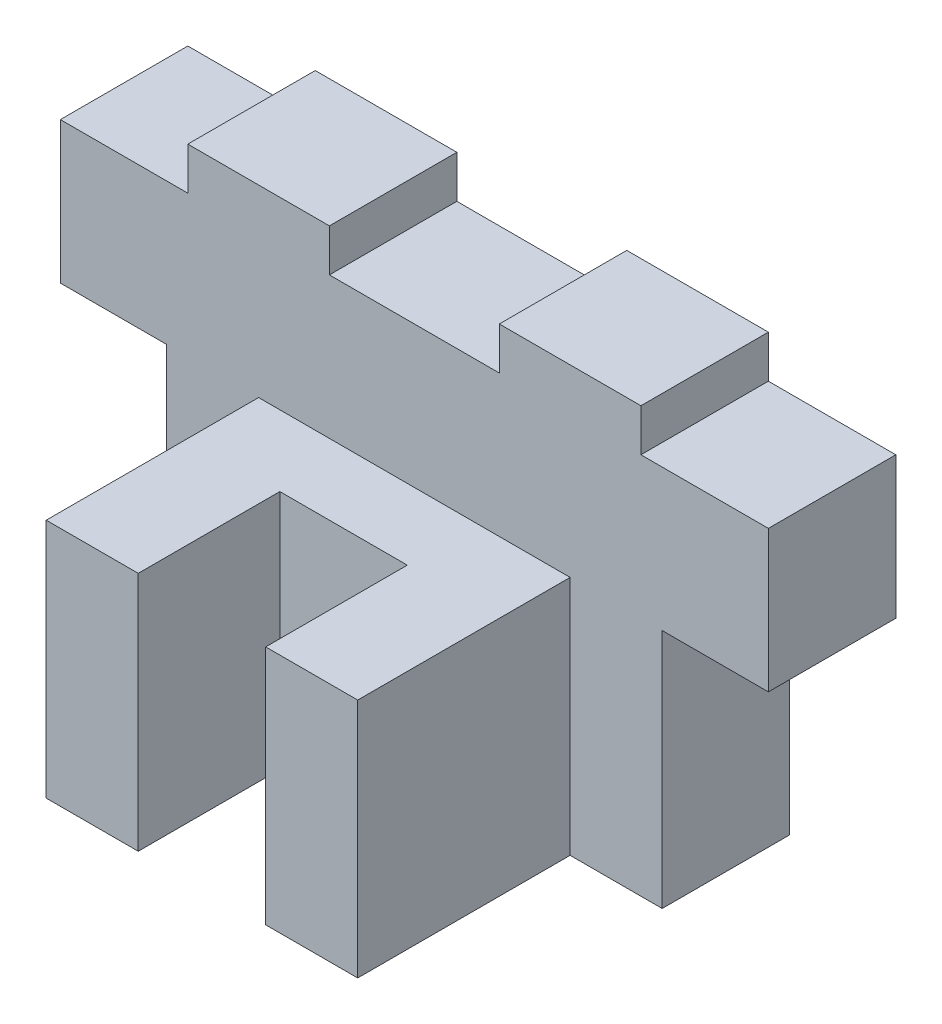
ISO-10303-21;
HEADER;
FILE_DESCRIPTION(('STEP AP214'),'2;1');
FILE_NAME('part.step','',(''),(''),'','','');
FILE_SCHEMA(('AUTOMOTIVE_DESIGN { 1 0 10303 214 1 1 1 1 }'));
ENDSEC;
DATA;
#1=APPLICATION_CONTEXT('core data for automotive mechanical design processes');
#2=APPLICATION_PROTOCOL_DEFINITION('international standard','automotive_design',2000,#1);
#3=PRODUCT_CONTEXT('',#1,'mechanical');
#4=PRODUCT('Part','Part','',(#3));
#5=PRODUCT_RELATED_PRODUCT_CATEGORY('part','',(#4));
#6=PRODUCT_DEFINITION_FORMATION('','',#4);
#7=PRODUCT_DEFINITION_CONTEXT('part definition',#1,'design');
#8=PRODUCT_DEFINITION('design','',#6,#7);
#9=PRODUCT_DEFINITION_SHAPE('','',#8);
#10=(LENGTH_UNIT() NAMED_UNIT(*) SI_UNIT(.MILLI.,.METRE.));
#11=(NAMED_UNIT(*) PLANE_ANGLE_UNIT() SI_UNIT($,.RADIAN.));
#12=(NAMED_UNIT(*) SI_UNIT($,.STERADIAN.) SOLID_ANGLE_UNIT());
#13=UNCERTAINTY_MEASURE_WITH_UNIT(LENGTH_MEASURE(1.E-05),#10,'distance_accuracy_value','');
#14=(GEOMETRIC_REPRESENTATION_CONTEXT(3) GLOBAL_UNCERTAINTY_ASSIGNED_CONTEXT((#13)) GLOBAL_UNIT_ASSIGNED_CONTEXT((#10,
#11,#12)) REPRESENTATION_CONTEXT('',''));
#15=CARTESIAN_POINT('',(0.,0.,0.));
#16=DIRECTION('',(0.,0.,1.));
#17=DIRECTION('',(1.,0.,0.));
#18=AXIS2_PLACEMENT_3D('',#15,#16,#17);
#19=CARTESIAN_POINT('',(0.,0.,9.));
#20=DIRECTION('',(0.,0.,1.));
#21=DIRECTION('',(1.,0.,0.));
#22=AXIS2_PLACEMENT_3D('',#19,#20,#21);
#23=PLANE('',#22);
#24=DIRECTION('',(-1.,0.,0.));
#25=VECTOR('',#24,1.);
#26=CARTESIAN_POINT('',(-25.,-15.,9.));
#27=LINE('',#26,#25);
#28=CARTESIAN_POINT('',(-23.5,-15.,9.));
#29=VERTEX_POINT('',#28);
#30=CARTESIAN_POINT('',(-30.,-15.,9.));
#31=VERTEX_POINT('',#30);
#32=EDGE_CURVE('E38',#29,#31,#27,.T.);
#33=ORIENTED_EDGE('',*,*,#32,.F.);
#34=DIRECTION('',(0.,-1.,0.));
#35=VECTOR('',#34,1.);
#36=CARTESIAN_POINT('',(-23.5,20.6010752377383,9.));
#37=LINE('',#36,#35);
#38=CARTESIAN_POINT('',(-23.5,2.,9.));
#39=VERTEX_POINT('',#38);
#40=EDGE_CURVE('E227',#39,#29,#37,.T.);
#41=ORIENTED_EDGE('',*,*,#40,.F.);
#42=DIRECTION('',(1.,0.,0.));
#43=VECTOR('',#42,1.);
#44=CARTESIAN_POINT('',(0.,2.,9.));
#45=LINE('',#44,#43);
#46=CARTESIAN_POINT('',(-1.5,2.,9.));
#47=VERTEX_POINT('',#46);
#48=EDGE_CURVE('E51',#39,#47,#45,.T.);
#49=ORIENTED_EDGE('',*,*,#48,.T.);
#50=DIRECTION('',(0.,-1.,0.));
#51=VECTOR('',#50,1.);
#52=CARTESIAN_POINT('',(-1.5,20.6010752377383,9.));
#53=LINE('',#52,#51);
#54=CARTESIAN_POINT('',(-1.5,-15.,9.));
#55=VERTEX_POINT('',#54);
#56=EDGE_CURVE('E309',#47,#55,#53,.T.);
#57=ORIENTED_EDGE('',*,*,#56,.T.);
#58=DIRECTION('',(1.,0.,0.));
#59=VECTOR('',#58,1.);
#60=CARTESIAN_POINT('',(0.,-15.,9.));
#61=LINE('',#60,#59);
#62=CARTESIAN_POINT('',(5.,-15.,9.));
#63=VERTEX_POINT('',#62);
#64=EDGE_CURVE('E360',#55,#63,#61,.T.);
#65=ORIENTED_EDGE('',*,*,#64,.T.);
#66=DIRECTION('',(0.,1.,0.));
#67=VECTOR('',#66,1.);
#68=CARTESIAN_POINT('',(5.,0.,9.));
#69=LINE('',#68,#67);
#70=CARTESIAN_POINT('',(5.,2.,9.));
#71=VERTEX_POINT('',#70);
#72=EDGE_CURVE('E375',#63,#71,#69,.T.);
#73=ORIENTED_EDGE('',*,*,#72,.T.);
#74=DIRECTION('',(-1.,0.,0.));
#75=VECTOR('',#74,1.);
#76=CARTESIAN_POINT('',(0.,2.,9.));
#77=LINE('',#76,#75);
#78=CARTESIAN_POINT('',(12.5,2.,9.));
#79=VERTEX_POINT('',#78);
#80=EDGE_CURVE('E379',#79,#71,#77,.T.);
#81=ORIENTED_EDGE('',*,*,#80,.F.);
#82=DIRECTION('',(0.,1.,0.));
#83=VECTOR('',#82,1.);
#84=CARTESIAN_POINT('',(12.5,0.,9.));
#85=LINE('',#84,#83);
#86=CARTESIAN_POINT('',(12.5,12.,9.));
#87=VERTEX_POINT('',#86);
#88=EDGE_CURVE('E382',#79,#87,#85,.T.);
#89=ORIENTED_EDGE('',*,*,#88,.T.);
#90=DIRECTION('',(-1.,0.,0.));
#91=VECTOR('',#90,1.);
#92=CARTESIAN_POINT('',(0.,12.,9.));
#93=LINE('',#92,#91);
#94=CARTESIAN_POINT('',(3.5,12.,9.));
#95=VERTEX_POINT('',#94);
#96=EDGE_CURVE('E384',#87,#95,#93,.T.);
#97=ORIENTED_EDGE('',*,*,#96,.T.);
#98=DIRECTION('',(0.,-1.,0.));
#99=VECTOR('',#98,1.);
#100=CARTESIAN_POINT('',(3.5,0.,9.));
#101=LINE('',#100,#99);
#102=CARTESIAN_POINT('',(3.5,15.,9.));
#103=VERTEX_POINT('',#102);
#104=EDGE_CURVE('E386',#103,#95,#101,.T.);
#105=ORIENTED_EDGE('',*,*,#104,.F.);
#106=DIRECTION('',(1.,0.,0.));
#107=VECTOR('',#106,1.);
#108=CARTESIAN_POINT('',(0.,15.,9.));
#109=LINE('',#108,#107);
#110=CARTESIAN_POINT('',(-6.5,15.,9.));
#111=VERTEX_POINT('',#110);
#112=EDGE_CURVE('E389',#111,#103,#109,.T.);
#113=ORIENTED_EDGE('',*,*,#112,.F.);
#114=DIRECTION('',(0.,-1.,0.));
#115=VECTOR('',#114,1.);
#116=CARTESIAN_POINT('',(-6.5,0.,9.));
#117=LINE('',#116,#115);
#118=CARTESIAN_POINT('',(-6.5,12.,9.));
#119=VERTEX_POINT('',#118);
#120=EDGE_CURVE('E391',#111,#119,#117,.T.);
#121=ORIENTED_EDGE('',*,*,#120,.T.);
#122=DIRECTION('',(1.,0.,0.));
#123=VECTOR('',#122,1.);
#124=CARTESIAN_POINT('',(0.,12.,9.));
#125=LINE('',#124,#123);
#126=CARTESIAN_POINT('',(-18.5,12.,9.));
#127=VERTEX_POINT('',#126);
#128=EDGE_CURVE('E338',#127,#119,#125,.T.);
#129=ORIENTED_EDGE('',*,*,#128,.F.);
#130=DIRECTION('',(0.,-1.,0.));
#131=VECTOR('',#130,1.);
#132=CARTESIAN_POINT('',(-18.5,0.,9.));
#133=LINE('',#132,#131);
#134=CARTESIAN_POINT('',(-18.5,15.,9.));
#135=VERTEX_POINT('',#134);
#136=EDGE_CURVE('E246',#135,#127,#133,.T.);
#137=ORIENTED_EDGE('',*,*,#136,.F.);
#138=DIRECTION('',(-1.,0.,0.));
#139=VECTOR('',#138,1.);
#140=CARTESIAN_POINT('',(-25.,15.,9.));
#141=LINE('',#140,#139);
#142=CARTESIAN_POINT('',(-28.5,15.,9.));
#143=VERTEX_POINT('',#142);
#144=EDGE_CURVE('E249',#135,#143,#141,.T.);
#145=ORIENTED_EDGE('',*,*,#144,.T.);
#146=DIRECTION('',(0.,-1.,0.));
#147=VECTOR('',#146,1.);
#148=CARTESIAN_POINT('',(-28.5,0.,9.));
#149=LINE('',#148,#147);
#150=CARTESIAN_POINT('',(-28.5,12.,9.));
#151=VERTEX_POINT('',#150);
#152=EDGE_CURVE('E251',#143,#151,#149,.T.);
#153=ORIENTED_EDGE('',*,*,#152,.T.);
#154=DIRECTION('',(1.,0.,0.));
#155=VECTOR('',#154,1.);
#156=CARTESIAN_POINT('',(-25.,12.,9.));
#157=LINE('',#156,#155);
#158=CARTESIAN_POINT('',(-37.5,12.,9.));
#159=VERTEX_POINT('',#158);
#160=EDGE_CURVE('E253',#159,#151,#157,.T.);
#161=ORIENTED_EDGE('',*,*,#160,.F.);
#162=DIRECTION('',(0.,1.,0.));
#163=VECTOR('',#162,1.);
#164=CARTESIAN_POINT('',(-37.5,0.,9.));
#165=LINE('',#164,#163);
#166=CARTESIAN_POINT('',(-37.5,1.99999999999999,9.));
#167=VERTEX_POINT('',#166);
#168=EDGE_CURVE('E256',#167,#159,#165,.T.);
#169=ORIENTED_EDGE('',*,*,#168,.F.);
#170=DIRECTION('',(1.,0.,0.));
#171=VECTOR('',#170,1.);
#172=CARTESIAN_POINT('',(-25.,2.,9.));
#173=LINE('',#172,#171);
#174=CARTESIAN_POINT('',(-30.,1.99999999999999,9.));
#175=VERTEX_POINT('',#174);
#176=EDGE_CURVE('E259',#167,#175,#173,.T.);
#177=ORIENTED_EDGE('',*,*,#176,.T.);
#178=DIRECTION('',(0.,1.,0.));
#179=VECTOR('',#178,1.);
#180=CARTESIAN_POINT('',(-30.,0.,9.));
#181=LINE('',#180,#179);
#182=EDGE_CURVE('E261',#31,#175,#181,.T.);
#183=ORIENTED_EDGE('',*,*,#182,.F.);
#184=EDGE_LOOP('',(#33,#41,#49,#57,#65,#73,#81,#89,#97,#105,#113,#121,#129,#137,#145,#153,#161,
#169,#177,#183));
#185=FACE_BOUND('',#184,.T.);
#186=ADVANCED_FACE('F34',(#185),#23,.T.);
#187=CARTESIAN_POINT('',(0.,-15.,9.));
#188=DIRECTION('',(0.,1.,0.));
#189=DIRECTION('',(-1.,0.,0.));
#190=AXIS2_PLACEMENT_3D('',#187,#188,#189);
#191=PLANE('',#190);
#192=DIRECTION('',(-1.,0.,0.));
#193=VECTOR('',#192,1.);
#194=CARTESIAN_POINT('',(0.,-15.,14.));
#195=LINE('',#194,#193);
#196=CARTESIAN_POINT('',(-8.,-15.,14.));
#197=VERTEX_POINT('',#196);
#198=CARTESIAN_POINT('',(-17.,-15.,14.));
#199=VERTEX_POINT('',#198);
#200=EDGE_CURVE('E213',#197,#199,#195,.T.);
#201=ORIENTED_EDGE('',*,*,#200,.T.);
#202=DIRECTION('',(0.,0.,1.));
#203=VECTOR('',#202,1.);
#204=CARTESIAN_POINT('',(-17.,-15.,0.));
#205=LINE('',#204,#203);
#206=CARTESIAN_POINT('',(-17.,-15.,24.));
#207=VERTEX_POINT('',#206);
#208=EDGE_CURVE('E224',#199,#207,#205,.T.);
#209=ORIENTED_EDGE('',*,*,#208,.T.);
#210=DIRECTION('',(-1.,0.,0.));
#211=VECTOR('',#210,1.);
#212=CARTESIAN_POINT('',(-25.,-15.,24.));
#213=LINE('',#212,#211);
#214=CARTESIAN_POINT('',(-23.5,-15.,24.));
#215=VERTEX_POINT('',#214);
#216=EDGE_CURVE('E235',#207,#215,#213,.T.);
#217=ORIENTED_EDGE('',*,*,#216,.T.);
#218=DIRECTION('',(0.,0.,1.));
#219=VECTOR('',#218,1.);
#220=CARTESIAN_POINT('',(-23.5,-15.,0.));
#221=LINE('',#220,#219);
#222=EDGE_CURVE('E238',#29,#215,#221,.T.);
#223=ORIENTED_EDGE('',*,*,#222,.F.);
#224=ORIENTED_EDGE('',*,*,#32,.T.);
#225=DIRECTION('',(0.,0.,-1.));
#226=VECTOR('',#225,1.);
#227=CARTESIAN_POINT('',(-30.,-15.,9.));
#228=LINE('',#227,#226);
#229=CARTESIAN_POINT('',(-30.,-15.,0.));
#230=VERTEX_POINT('',#229);
#231=EDGE_CURVE('E264',#31,#230,#228,.T.);
#232=ORIENTED_EDGE('',*,*,#231,.T.);
#233=DIRECTION('',(1.,0.,0.));
#234=VECTOR('',#233,1.);
#235=CARTESIAN_POINT('',(0.,-15.,0.));
#236=LINE('',#235,#234);
#237=CARTESIAN_POINT('',(5.,-15.,0.));
#238=VERTEX_POINT('',#237);
#239=EDGE_CURVE('E326',#230,#238,#236,.T.);
#240=ORIENTED_EDGE('',*,*,#239,.T.);
#241=DIRECTION('',(0.,0.,-1.));
#242=VECTOR('',#241,1.);
#243=CARTESIAN_POINT('',(5.,-15.,9.));
#244=LINE('',#243,#242);
#245=EDGE_CURVE('E11',#63,#238,#244,.T.);
#246=ORIENTED_EDGE('',*,*,#245,.F.);
#247=ORIENTED_EDGE('',*,*,#64,.F.);
#248=DIRECTION('',(0.,0.,1.));
#249=VECTOR('',#248,1.);
#250=CARTESIAN_POINT('',(-1.5,-15.,0.));
#251=LINE('',#250,#249);
#252=CARTESIAN_POINT('',(-1.5,-15.,24.));
#253=VERTEX_POINT('',#252);
#254=EDGE_CURVE('E302',#55,#253,#251,.T.);
#255=ORIENTED_EDGE('',*,*,#254,.T.);
#256=DIRECTION('',(1.,0.,0.));
#257=VECTOR('',#256,1.);
#258=CARTESIAN_POINT('',(0.,-15.,24.));
#259=LINE('',#258,#257);
#260=CARTESIAN_POINT('',(-8.,-15.,24.));
#261=VERTEX_POINT('',#260);
#262=EDGE_CURVE('E304',#261,#253,#259,.T.);
#263=ORIENTED_EDGE('',*,*,#262,.F.);
#264=DIRECTION('',(0.,0.,1.));
#265=VECTOR('',#264,1.);
#266=CARTESIAN_POINT('',(-8.,-15.,0.));
#267=LINE('',#266,#265);
#268=EDGE_CURVE('E307',#197,#261,#267,.T.);
#269=ORIENTED_EDGE('',*,*,#268,.F.);
#270=EDGE_LOOP('',(#201,#209,#217,#223,#224,#232,#240,#246,#247,#255,#263,#269));
#271=FACE_BOUND('',#270,.T.);
#272=ADVANCED_FACE('F36',(#271),#191,.F.);
#273=CARTESIAN_POINT('',(5.,0.,9.));
#274=DIRECTION('',(-1.,0.,0.));
#275=DIRECTION('',(0.,0.,1.));
#276=AXIS2_PLACEMENT_3D('',#273,#274,#275);
#277=PLANE('',#276);
#278=DIRECTION('',(0.,1.,0.));
#279=VECTOR('',#278,1.);
#280=CARTESIAN_POINT('',(5.,0.,0.));
#281=LINE('',#280,#279);
#282=CARTESIAN_POINT('',(5.,2.,0.));
#283=VERTEX_POINT('',#282);
#284=EDGE_CURVE('E330',#238,#283,#281,.T.);
#285=ORIENTED_EDGE('',*,*,#284,.T.);
#286=DIRECTION('',(0.,0.,-1.));
#287=VECTOR('',#286,1.);
#288=CARTESIAN_POINT('',(5.,2.,9.));
#289=LINE('',#288,#287);
#290=EDGE_CURVE('E43',#71,#283,#289,.T.);
#291=ORIENTED_EDGE('',*,*,#290,.F.);
#292=ORIENTED_EDGE('',*,*,#72,.F.);
#293=ORIENTED_EDGE('',*,*,#245,.T.);
#294=EDGE_LOOP('',(#285,#291,#292,#293));
#295=FACE_BOUND('',#294,.T.);
#296=ADVANCED_FACE('F450',(#295),#277,.F.);
#297=CARTESIAN_POINT('',(0.,2.,9.));
#298=DIRECTION('',(0.,-1.,0.));
#299=DIRECTION('',(1.,0.,0.));
#300=AXIS2_PLACEMENT_3D('',#297,#298,#299);
#301=PLANE('',#300);
#302=DIRECTION('',(-1.,0.,0.));
#303=VECTOR('',#302,1.);
#304=CARTESIAN_POINT('',(0.,2.,0.));
#305=LINE('',#304,#303);
#306=CARTESIAN_POINT('',(12.5,2.,0.));
#307=VERTEX_POINT('',#306);
#308=EDGE_CURVE('E335',#307,#283,#305,.T.);
#309=ORIENTED_EDGE('',*,*,#308,.F.);
#310=DIRECTION('',(0.,0.,-1.));
#311=VECTOR('',#310,1.);
#312=CARTESIAN_POINT('',(12.5,2.,9.));
#313=LINE('',#312,#311);
#314=EDGE_CURVE('E372',#79,#307,#313,.T.);
#315=ORIENTED_EDGE('',*,*,#314,.F.);
#316=ORIENTED_EDGE('',*,*,#80,.T.);
#317=ORIENTED_EDGE('',*,*,#290,.T.);
#318=EDGE_LOOP('',(#309,#315,#316,#317));
#319=FACE_BOUND('',#318,.T.);
#320=ADVANCED_FACE('F457',(#319),#301,.T.);
#321=CARTESIAN_POINT('',(12.5,0.,9.));
#322=DIRECTION('',(-1.,0.,0.));
#323=DIRECTION('',(0.,-1.,0.));
#324=AXIS2_PLACEMENT_3D('',#321,#322,#323);
#325=PLANE('',#324);
#326=DIRECTION('',(0.,1.,0.));
#327=VECTOR('',#326,1.);
#328=CARTESIAN_POINT('',(12.5,0.,0.));
#329=LINE('',#328,#327);
#330=CARTESIAN_POINT('',(12.5,12.,0.));
#331=VERTEX_POINT('',#330);
#332=EDGE_CURVE('E343',#307,#331,#329,.T.);
#333=ORIENTED_EDGE('',*,*,#332,.T.);
#334=DIRECTION('',(0.,0.,-1.));
#335=VECTOR('',#334,1.);
#336=CARTESIAN_POINT('',(12.5,12.,9.));
#337=LINE('',#336,#335);
#338=EDGE_CURVE('E369',#87,#331,#337,.T.);
#339=ORIENTED_EDGE('',*,*,#338,.F.);
#340=ORIENTED_EDGE('',*,*,#88,.F.);
#341=ORIENTED_EDGE('',*,*,#314,.T.);
#342=EDGE_LOOP('',(#333,#339,#340,#341));
#343=FACE_BOUND('',#342,.T.);
#344=ADVANCED_FACE('F460',(#343),#325,.F.);
#345=CARTESIAN_POINT('',(0.,12.,9.));
#346=DIRECTION('',(0.,-1.,0.));
#347=DIRECTION('',(1.,0.,0.));
#348=AXIS2_PLACEMENT_3D('',#345,#346,#347);
#349=PLANE('',#348);
#350=DIRECTION('',(-1.,0.,0.));
#351=VECTOR('',#350,1.);
#352=CARTESIAN_POINT('',(0.,12.,0.));
#353=LINE('',#352,#351);
#354=CARTESIAN_POINT('',(3.5,12.,0.));
#355=VERTEX_POINT('',#354);
#356=EDGE_CURVE('E345',#331,#355,#353,.T.);
#357=ORIENTED_EDGE('',*,*,#356,.T.);
#358=DIRECTION('',(0.,0.,-1.));
#359=VECTOR('',#358,1.);
#360=CARTESIAN_POINT('',(3.5,12.,9.));
#361=LINE('',#360,#359);
#362=EDGE_CURVE('E367',#95,#355,#361,.T.);
#363=ORIENTED_EDGE('',*,*,#362,.F.);
#364=ORIENTED_EDGE('',*,*,#96,.F.);
#365=ORIENTED_EDGE('',*,*,#338,.T.);
#366=EDGE_LOOP('',(#357,#363,#364,#365));
#367=FACE_BOUND('',#366,.T.);
#368=ADVANCED_FACE('F465',(#367),#349,.F.);
#369=CARTESIAN_POINT('',(3.5,0.,9.));
#370=DIRECTION('',(1.,0.,0.));
#371=DIRECTION('',(0.,0.,-1.));
#372=AXIS2_PLACEMENT_3D('',#369,#370,#371);
#373=PLANE('',#372);
#374=DIRECTION('',(0.,-1.,0.));
#375=VECTOR('',#374,1.);
#376=CARTESIAN_POINT('',(3.5,0.,0.));
#377=LINE('',#376,#375);
#378=CARTESIAN_POINT('',(3.5,15.,0.));
#379=VERTEX_POINT('',#378);
#380=EDGE_CURVE('E348',#379,#355,#377,.T.);
#381=ORIENTED_EDGE('',*,*,#380,.F.);
#382=DIRECTION('',(0.,0.,-1.));
#383=VECTOR('',#382,1.);
#384=CARTESIAN_POINT('',(3.5,15.,9.));
#385=LINE('',#384,#383);
#386=EDGE_CURVE('E365',#103,#379,#385,.T.);
#387=ORIENTED_EDGE('',*,*,#386,.F.);
#388=ORIENTED_EDGE('',*,*,#104,.T.);
#389=ORIENTED_EDGE('',*,*,#362,.T.);
#390=EDGE_LOOP('',(#381,#387,#388,#389));
#391=FACE_BOUND('',#390,.T.);
#392=ADVANCED_FACE('F502',(#391),#373,.T.);
#393=CARTESIAN_POINT('',(0.,15.,9.));
#394=DIRECTION('',(0.,1.,0.));
#395=DIRECTION('',(0.,0.,1.));
#396=AXIS2_PLACEMENT_3D('',#393,#394,#395);
#397=PLANE('',#396);
#398=DIRECTION('',(1.,0.,0.));
#399=VECTOR('',#398,1.);
#400=CARTESIAN_POINT('',(0.,15.,0.));
#401=LINE('',#400,#399);
#402=CARTESIAN_POINT('',(-6.5,15.,0.));
#403=VERTEX_POINT('',#402);
#404=EDGE_CURVE('E351',#403,#379,#401,.T.);
#405=ORIENTED_EDGE('',*,*,#404,.F.);
#406=DIRECTION('',(0.,0.,-1.));
#407=VECTOR('',#406,1.);
#408=CARTESIAN_POINT('',(-6.5,15.,9.));
#409=LINE('',#408,#407);
#410=EDGE_CURVE('E363',#111,#403,#409,.T.);
#411=ORIENTED_EDGE('',*,*,#410,.F.);
#412=ORIENTED_EDGE('',*,*,#112,.T.);
#413=ORIENTED_EDGE('',*,*,#386,.T.);
#414=EDGE_LOOP('',(#405,#411,#412,#413));
#415=FACE_BOUND('',#414,.T.);
#416=ADVANCED_FACE('F470',(#415),#397,.T.);
#417=CARTESIAN_POINT('',(-6.5,0.,9.));
#418=DIRECTION('',(1.,0.,0.));
#419=DIRECTION('',(0.,0.,-1.));
#420=AXIS2_PLACEMENT_3D('',#417,#418,#419);
#421=PLANE('',#420);
#422=DIRECTION('',(0.,-1.,0.));
#423=VECTOR('',#422,1.);
#424=CARTESIAN_POINT('',(-6.5,0.,0.));
#425=LINE('',#424,#423);
#426=CARTESIAN_POINT('',(-6.5,12.,0.));
#427=VERTEX_POINT('',#426);
#428=EDGE_CURVE('E354',#403,#427,#425,.T.);
#429=ORIENTED_EDGE('',*,*,#428,.T.);
#430=DIRECTION('',(0.,0.,-1.));
#431=VECTOR('',#430,1.);
#432=CARTESIAN_POINT('',(-6.5,12.,9.));
#433=LINE('',#432,#431);
#434=EDGE_CURVE('E361',#119,#427,#433,.T.);
#435=ORIENTED_EDGE('',*,*,#434,.F.);
#436=ORIENTED_EDGE('',*,*,#120,.F.);
#437=ORIENTED_EDGE('',*,*,#410,.T.);
#438=EDGE_LOOP('',(#429,#435,#436,#437));
#439=FACE_BOUND('',#438,.T.);
#440=ADVANCED_FACE('F474',(#439),#421,.F.);
#441=CARTESIAN_POINT('',(0.,12.,9.));
#442=DIRECTION('',(0.,1.,0.));
#443=DIRECTION('',(0.,0.,1.));
#444=AXIS2_PLACEMENT_3D('',#441,#442,#443);
#445=PLANE('',#444);
#446=DIRECTION('',(1.,0.,0.));
#447=VECTOR('',#446,1.);
#448=CARTESIAN_POINT('',(0.,12.,0.));
#449=LINE('',#448,#447);
#450=CARTESIAN_POINT('',(-18.5,12.,0.));
#451=VERTEX_POINT('',#450);
#452=EDGE_CURVE('E357',#451,#427,#449,.T.);
#453=ORIENTED_EDGE('',*,*,#452,.F.);
#454=DIRECTION('',(0.,0.,-1.));
#455=VECTOR('',#454,1.);
#456=CARTESIAN_POINT('',(-18.5,12.,9.));
#457=LINE('',#456,#455);
#458=EDGE_CURVE('E299',#127,#451,#457,.T.);
#459=ORIENTED_EDGE('',*,*,#458,.F.);
#460=ORIENTED_EDGE('',*,*,#128,.T.);
#461=ORIENTED_EDGE('',*,*,#434,.T.);
#462=EDGE_LOOP('',(#453,#459,#460,#461));
#463=FACE_BOUND('',#462,.T.);
#464=ADVANCED_FACE('F398',(#463),#445,.T.);
#465=CARTESIAN_POINT('',(0.,0.,0.));
#466=DIRECTION('',(0.,0.,1.));
#467=DIRECTION('',(1.,0.,0.));
#468=AXIS2_PLACEMENT_3D('',#465,#466,#467);
#469=PLANE('',#468);
#470=ORIENTED_EDGE('',*,*,#239,.F.);
#471=DIRECTION('',(0.,1.,0.));
#472=VECTOR('',#471,1.);
#473=CARTESIAN_POINT('',(-30.,0.,0.));
#474=LINE('',#473,#472);
#475=CARTESIAN_POINT('',(-30.,1.99999999999999,0.));
#476=VERTEX_POINT('',#475);
#477=EDGE_CURVE('E281',#230,#476,#474,.T.);
#478=ORIENTED_EDGE('',*,*,#477,.T.);
#479=DIRECTION('',(1.,0.,0.));
#480=VECTOR('',#479,1.);
#481=CARTESIAN_POINT('',(-25.,2.,0.));
#482=LINE('',#481,#480);
#483=CARTESIAN_POINT('',(-37.5,1.99999999999999,0.));
#484=VERTEX_POINT('',#483);
#485=EDGE_CURVE('E278',#484,#476,#482,.T.);
#486=ORIENTED_EDGE('',*,*,#485,.F.);
#487=DIRECTION('',(0.,1.,0.));
#488=VECTOR('',#487,1.);
#489=CARTESIAN_POINT('',(-37.5,0.,0.));
#490=LINE('',#489,#488);
#491=CARTESIAN_POINT('',(-37.5,12.,0.));
#492=VERTEX_POINT('',#491);
#493=EDGE_CURVE('E275',#484,#492,#490,.T.);
#494=ORIENTED_EDGE('',*,*,#493,.T.);
#495=DIRECTION('',(1.,0.,0.));
#496=VECTOR('',#495,1.);
#497=CARTESIAN_POINT('',(-25.,12.,0.));
#498=LINE('',#497,#496);
#499=CARTESIAN_POINT('',(-28.5,12.,0.));
#500=VERTEX_POINT('',#499);
#501=EDGE_CURVE('E272',#492,#500,#498,.T.);
#502=ORIENTED_EDGE('',*,*,#501,.T.);
#503=DIRECTION('',(0.,-1.,0.));
#504=VECTOR('',#503,1.);
#505=CARTESIAN_POINT('',(-28.5,0.,0.));
#506=LINE('',#505,#504);
#507=CARTESIAN_POINT('',(-28.5,15.,0.));
#508=VERTEX_POINT('',#507);
#509=EDGE_CURVE('E269',#508,#500,#506,.T.);
#510=ORIENTED_EDGE('',*,*,#509,.F.);
#511=DIRECTION('',(-1.,0.,0.));
#512=VECTOR('',#511,1.);
#513=CARTESIAN_POINT('',(-25.,15.,0.));
#514=LINE('',#513,#512);
#515=CARTESIAN_POINT('',(-18.5,15.,0.));
#516=VERTEX_POINT('',#515);
#517=EDGE_CURVE('E267',#516,#508,#514,.T.);
#518=ORIENTED_EDGE('',*,*,#517,.F.);
#519=DIRECTION('',(0.,-1.,0.));
#520=VECTOR('',#519,1.);
#521=CARTESIAN_POINT('',(-18.5,0.,0.));
#522=LINE('',#521,#520);
#523=EDGE_CURVE('E232',#516,#451,#522,.T.);
#524=ORIENTED_EDGE('',*,*,#523,.T.);
#525=ORIENTED_EDGE('',*,*,#452,.T.);
#526=ORIENTED_EDGE('',*,*,#428,.F.);
#527=ORIENTED_EDGE('',*,*,#404,.T.);
#528=ORIENTED_EDGE('',*,*,#380,.T.);
#529=ORIENTED_EDGE('',*,*,#356,.F.);
#530=ORIENTED_EDGE('',*,*,#332,.F.);
#531=ORIENTED_EDGE('',*,*,#308,.T.);
#532=ORIENTED_EDGE('',*,*,#284,.F.);
#533=EDGE_LOOP('',(#470,#478,#486,#494,#502,#510,#518,#524,#525,#526,#527,#528,#529,#530,#531,#532));
#534=FACE_BOUND('',#533,.T.);
#535=ADVANCED_FACE('F476',(#534),#469,.F.);
#536=CARTESIAN_POINT('',(-8.,20.6010752377383,0.));
#537=DIRECTION('',(1.,0.,0.));
#538=DIRECTION('',(0.,0.,-1.));
#539=AXIS2_PLACEMENT_3D('',#536,#537,#538);
#540=PLANE('',#539);
#541=DIRECTION('',(0.,-1.,0.));
#542=VECTOR('',#541,1.);
#543=CARTESIAN_POINT('',(-8.,20.6010752377383,24.));
#544=LINE('',#543,#542);
#545=CARTESIAN_POINT('',(-8.,2.,24.));
#546=VERTEX_POINT('',#545);
#547=EDGE_CURVE('E201',#546,#261,#544,.T.);
#548=ORIENTED_EDGE('',*,*,#547,.F.);
#549=DIRECTION('',(0.,0.,-1.));
#550=VECTOR('',#549,1.);
#551=CARTESIAN_POINT('',(-8.,2.,0.));
#552=LINE('',#551,#550);
#553=CARTESIAN_POINT('',(-8.,2.,14.));
#554=VERTEX_POINT('',#553);
#555=EDGE_CURVE('E196',#546,#554,#552,.T.);
#556=ORIENTED_EDGE('',*,*,#555,.T.);
#557=DIRECTION('',(0.,1.,0.));
#558=VECTOR('',#557,1.);
#559=CARTESIAN_POINT('',(-8.,-15.00005,14.));
#560=LINE('',#559,#558);
#561=EDGE_CURVE('E200',#197,#554,#560,.T.);
#562=ORIENTED_EDGE('',*,*,#561,.F.);
#563=ORIENTED_EDGE('',*,*,#268,.T.);
#564=EDGE_LOOP('',(#548,#556,#562,#563));
#565=FACE_BOUND('',#564,.T.);
#566=ADVANCED_FACE('F198',(#565),#540,.F.);
#567=CARTESIAN_POINT('',(0.,20.6010752377383,24.));
#568=DIRECTION('',(0.,0.,-1.));
#569=DIRECTION('',(-1.,0.,0.));
#570=AXIS2_PLACEMENT_3D('',#567,#568,#569);
#571=PLANE('',#570);
#572=DIRECTION('',(0.,-1.,0.));
#573=VECTOR('',#572,1.);
#574=CARTESIAN_POINT('',(-1.5,20.6010752377383,24.));
#575=LINE('',#574,#573);
#576=CARTESIAN_POINT('',(-1.5,2.,24.));
#577=VERTEX_POINT('',#576);
#578=EDGE_CURVE('E311',#577,#253,#575,.T.);
#579=ORIENTED_EDGE('',*,*,#578,.F.);
#580=DIRECTION('',(-1.,0.,0.));
#581=VECTOR('',#580,1.);
#582=CARTESIAN_POINT('',(0.,2.,24.));
#583=LINE('',#582,#581);
#584=EDGE_CURVE('E204',#577,#546,#583,.T.);
#585=ORIENTED_EDGE('',*,*,#584,.T.);
#586=ORIENTED_EDGE('',*,*,#547,.T.);
#587=ORIENTED_EDGE('',*,*,#262,.T.);
#588=EDGE_LOOP('',(#579,#585,#586,#587));
#589=FACE_BOUND('',#588,.T.);
#590=ADVANCED_FACE('F445',(#589),#571,.F.);
#591=CARTESIAN_POINT('',(-1.5,20.6010752377383,0.));
#592=DIRECTION('',(1.,0.,0.));
#593=DIRECTION('',(0.,0.,-1.));
#594=AXIS2_PLACEMENT_3D('',#591,#592,#593);
#595=PLANE('',#594);
#596=DIRECTION('',(0.,0.,-1.));
#597=VECTOR('',#596,1.);
#598=CARTESIAN_POINT('',(-1.5,2.,0.));
#599=LINE('',#598,#597);
#600=EDGE_CURVE('E315',#577,#47,#599,.T.);
#601=ORIENTED_EDGE('',*,*,#600,.F.);
#602=ORIENTED_EDGE('',*,*,#578,.T.);
#603=ORIENTED_EDGE('',*,*,#254,.F.);
#604=ORIENTED_EDGE('',*,*,#56,.F.);
#605=EDGE_LOOP('',(#601,#602,#603,#604));
#606=FACE_BOUND('',#605,.T.);
#607=ADVANCED_FACE('F447',(#606),#595,.T.);
#608=CARTESIAN_POINT('',(0.,2.,9.));
#609=DIRECTION('',(0.,-1.,0.));
#610=DIRECTION('',(1.,0.,0.));
#611=AXIS2_PLACEMENT_3D('',#608,#609,#610);
#612=PLANE('',#611);
#613=DIRECTION('',(0.,0.,-1.));
#614=VECTOR('',#613,1.);
#615=CARTESIAN_POINT('',(-17.,1.99999999999999,0.));
#616=LINE('',#615,#614);
#617=CARTESIAN_POINT('',(-17.,1.99999999999999,24.));
#618=VERTEX_POINT('',#617);
#619=CARTESIAN_POINT('',(-17.,2.,14.));
#620=VERTEX_POINT('',#619);
#621=EDGE_CURVE('E218',#618,#620,#616,.T.);
#622=ORIENTED_EDGE('',*,*,#621,.T.);
#623=DIRECTION('',(-1.,0.,0.));
#624=VECTOR('',#623,1.);
#625=CARTESIAN_POINT('',(-17.,2.,14.));
#626=LINE('',#625,#624);
#627=EDGE_CURVE('E211',#554,#620,#626,.T.);
#628=ORIENTED_EDGE('',*,*,#627,.F.);
#629=ORIENTED_EDGE('',*,*,#555,.F.);
#630=ORIENTED_EDGE('',*,*,#584,.F.);
#631=ORIENTED_EDGE('',*,*,#600,.T.);
#632=ORIENTED_EDGE('',*,*,#48,.F.);
#633=DIRECTION('',(0.,0.,-1.));
#634=VECTOR('',#633,1.);
#635=CARTESIAN_POINT('',(-23.5,1.99999999999999,0.));
#636=LINE('',#635,#634);
#637=CARTESIAN_POINT('',(-23.5,1.99999999999999,24.));
#638=VERTEX_POINT('',#637);
#639=EDGE_CURVE('E229',#638,#39,#636,.T.);
#640=ORIENTED_EDGE('',*,*,#639,.F.);
#641=DIRECTION('',(1.,0.,0.));
#642=VECTOR('',#641,1.);
#643=CARTESIAN_POINT('',(-25.,1.99999999999999,24.));
#644=LINE('',#643,#642);
#645=EDGE_CURVE('E226',#638,#618,#644,.T.);
#646=ORIENTED_EDGE('',*,*,#645,.T.);
#647=EDGE_LOOP('',(#622,#628,#629,#630,#631,#632,#640,#646));
#648=FACE_BOUND('',#647,.T.);
#649=ADVANCED_FACE('F216',(#648),#612,.F.);
#650=CARTESIAN_POINT('',(-18.5,0.,9.));
#651=DIRECTION('',(1.,0.,0.));
#652=DIRECTION('',(0.,1.,0.));
#653=AXIS2_PLACEMENT_3D('',#650,#651,#652);
#654=PLANE('',#653);
#655=ORIENTED_EDGE('',*,*,#523,.F.);
#656=DIRECTION('',(0.,0.,-1.));
#657=VECTOR('',#656,1.);
#658=CARTESIAN_POINT('',(-18.5,15.,9.));
#659=LINE('',#658,#657);
#660=EDGE_CURVE('E297',#135,#516,#659,.T.);
#661=ORIENTED_EDGE('',*,*,#660,.F.);
#662=ORIENTED_EDGE('',*,*,#136,.T.);
#663=ORIENTED_EDGE('',*,*,#458,.T.);
#664=EDGE_LOOP('',(#655,#661,#662,#663));
#665=FACE_BOUND('',#664,.T.);
#666=ADVANCED_FACE('F404',(#665),#654,.T.);
#667=CARTESIAN_POINT('',(-25.,15.,9.));
#668=DIRECTION('',(0.,-1.,0.));
#669=DIRECTION('',(1.,0.,0.));
#670=AXIS2_PLACEMENT_3D('',#667,#668,#669);
#671=PLANE('',#670);
#672=ORIENTED_EDGE('',*,*,#517,.T.);
#673=DIRECTION('',(0.,0.,-1.));
#674=VECTOR('',#673,1.);
#675=CARTESIAN_POINT('',(-28.5,15.,9.));
#676=LINE('',#675,#674);
#677=EDGE_CURVE('E294',#143,#508,#676,.T.);
#678=ORIENTED_EDGE('',*,*,#677,.F.);
#679=ORIENTED_EDGE('',*,*,#144,.F.);
#680=ORIENTED_EDGE('',*,*,#660,.T.);
#681=EDGE_LOOP('',(#672,#678,#679,#680));
#682=FACE_BOUND('',#681,.T.);
#683=ADVANCED_FACE('F407',(#682),#671,.F.);
#684=CARTESIAN_POINT('',(-28.5,0.,9.));
#685=DIRECTION('',(1.,0.,0.));
#686=DIRECTION('',(0.,1.,0.));
#687=AXIS2_PLACEMENT_3D('',#684,#685,#686);
#688=PLANE('',#687);
#689=ORIENTED_EDGE('',*,*,#509,.T.);
#690=DIRECTION('',(0.,0.,-1.));
#691=VECTOR('',#690,1.);
#692=CARTESIAN_POINT('',(-28.5,12.,9.));
#693=LINE('',#692,#691);
#694=EDGE_CURVE('E292',#151,#500,#693,.T.);
#695=ORIENTED_EDGE('',*,*,#694,.F.);
#696=ORIENTED_EDGE('',*,*,#152,.F.);
#697=ORIENTED_EDGE('',*,*,#677,.T.);
#698=EDGE_LOOP('',(#689,#695,#696,#697));
#699=FACE_BOUND('',#698,.T.);
#700=ADVANCED_FACE('F412',(#699),#688,.F.);
#701=CARTESIAN_POINT('',(-25.,12.,9.));
#702=DIRECTION('',(0.,1.,0.));
#703=DIRECTION('',(-1.,0.,0.));
#704=AXIS2_PLACEMENT_3D('',#701,#702,#703);
#705=PLANE('',#704);
#706=ORIENTED_EDGE('',*,*,#501,.F.);
#707=DIRECTION('',(0.,0.,-1.));
#708=VECTOR('',#707,1.);
#709=CARTESIAN_POINT('',(-37.5,12.,9.));
#710=LINE('',#709,#708);
#711=EDGE_CURVE('E290',#159,#492,#710,.T.);
#712=ORIENTED_EDGE('',*,*,#711,.F.);
#713=ORIENTED_EDGE('',*,*,#160,.T.);
#714=ORIENTED_EDGE('',*,*,#694,.T.);
#715=EDGE_LOOP('',(#706,#712,#713,#714));
#716=FACE_BOUND('',#715,.T.);
#717=ADVANCED_FACE('F477',(#716),#705,.T.);
#718=CARTESIAN_POINT('',(-37.5,0.,9.));
#719=DIRECTION('',(-1.,0.,0.));
#720=DIRECTION('',(0.,-1.,0.));
#721=AXIS2_PLACEMENT_3D('',#718,#719,#720);
#722=PLANE('',#721);
#723=ORIENTED_EDGE('',*,*,#493,.F.);
#724=DIRECTION('',(0.,0.,-1.));
#725=VECTOR('',#724,1.);
#726=CARTESIAN_POINT('',(-37.5,1.99999999999999,9.));
#727=LINE('',#726,#725);
#728=EDGE_CURVE('E288',#167,#484,#727,.T.);
#729=ORIENTED_EDGE('',*,*,#728,.F.);
#730=ORIENTED_EDGE('',*,*,#168,.T.);
#731=ORIENTED_EDGE('',*,*,#711,.T.);
#732=EDGE_LOOP('',(#723,#729,#730,#731));
#733=FACE_BOUND('',#732,.T.);
#734=ADVANCED_FACE('F418',(#733),#722,.T.);
#735=CARTESIAN_POINT('',(-25.,2.,9.));
#736=DIRECTION('',(0.,1.,0.));
#737=DIRECTION('',(-1.,0.,0.));
#738=AXIS2_PLACEMENT_3D('',#735,#736,#737);
#739=PLANE('',#738);
#740=ORIENTED_EDGE('',*,*,#485,.T.);
#741=DIRECTION('',(0.,0.,-1.));
#742=VECTOR('',#741,1.);
#743=CARTESIAN_POINT('',(-30.,1.99999999999999,9.));
#744=LINE('',#743,#742);
#745=EDGE_CURVE('E286',#175,#476,#744,.T.);
#746=ORIENTED_EDGE('',*,*,#745,.F.);
#747=ORIENTED_EDGE('',*,*,#176,.F.);
#748=ORIENTED_EDGE('',*,*,#728,.T.);
#749=EDGE_LOOP('',(#740,#746,#747,#748));
#750=FACE_BOUND('',#749,.T.);
#751=ADVANCED_FACE('F424',(#750),#739,.F.);
#752=CARTESIAN_POINT('',(-30.,0.,9.));
#753=DIRECTION('',(-1.,0.,0.));
#754=DIRECTION('',(0.,-1.,0.));
#755=AXIS2_PLACEMENT_3D('',#752,#753,#754);
#756=PLANE('',#755);
#757=ORIENTED_EDGE('',*,*,#477,.F.);
#758=ORIENTED_EDGE('',*,*,#231,.F.);
#759=ORIENTED_EDGE('',*,*,#182,.T.);
#760=ORIENTED_EDGE('',*,*,#745,.T.);
#761=EDGE_LOOP('',(#757,#758,#759,#760));
#762=FACE_BOUND('',#761,.T.);
#763=ADVANCED_FACE('F428',(#762),#756,.T.);
#764=CARTESIAN_POINT('',(-23.5,20.6010752377383,0.));
#765=DIRECTION('',(1.,0.,0.));
#766=DIRECTION('',(0.,1.,0.));
#767=AXIS2_PLACEMENT_3D('',#764,#765,#766);
#768=PLANE('',#767);
#769=DIRECTION('',(0.,-1.,0.));
#770=VECTOR('',#769,1.);
#771=CARTESIAN_POINT('',(-23.5,20.6010752377383,24.));
#772=LINE('',#771,#770);
#773=EDGE_CURVE('E243',#638,#215,#772,.T.);
#774=ORIENTED_EDGE('',*,*,#773,.F.);
#775=ORIENTED_EDGE('',*,*,#639,.T.);
#776=ORIENTED_EDGE('',*,*,#40,.T.);
#777=ORIENTED_EDGE('',*,*,#222,.T.);
#778=EDGE_LOOP('',(#774,#775,#776,#777));
#779=FACE_BOUND('',#778,.T.);
#780=ADVANCED_FACE('F433',(#779),#768,.F.);
#781=CARTESIAN_POINT('',(-25.,20.6010752377383,24.));
#782=DIRECTION('',(0.,0.,1.));
#783=DIRECTION('',(1.,0.,0.));
#784=AXIS2_PLACEMENT_3D('',#781,#782,#783);
#785=PLANE('',#784);
#786=ORIENTED_EDGE('',*,*,#645,.F.);
#787=ORIENTED_EDGE('',*,*,#773,.T.);
#788=ORIENTED_EDGE('',*,*,#216,.F.);
#789=DIRECTION('',(0.,-1.,0.));
#790=VECTOR('',#789,1.);
#791=CARTESIAN_POINT('',(-17.,20.6010752377383,24.));
#792=LINE('',#791,#790);
#793=EDGE_CURVE('E241',#618,#207,#792,.T.);
#794=ORIENTED_EDGE('',*,*,#793,.F.);
#795=EDGE_LOOP('',(#786,#787,#788,#794));
#796=FACE_BOUND('',#795,.T.);
#797=ADVANCED_FACE('F437',(#796),#785,.T.);
#798=CARTESIAN_POINT('',(-17.,20.6010752377383,0.));
#799=DIRECTION('',(1.,0.,0.));
#800=DIRECTION('',(0.,1.,0.));
#801=AXIS2_PLACEMENT_3D('',#798,#799,#800);
#802=PLANE('',#801);
#803=ORIENTED_EDGE('',*,*,#621,.F.);
#804=ORIENTED_EDGE('',*,*,#793,.T.);
#805=ORIENTED_EDGE('',*,*,#208,.F.);
#806=DIRECTION('',(0.,1.,0.));
#807=VECTOR('',#806,1.);
#808=CARTESIAN_POINT('',(-17.,-15.00005,14.));
#809=LINE('',#808,#807);
#810=EDGE_CURVE('E214',#199,#620,#809,.T.);
#811=ORIENTED_EDGE('',*,*,#810,.T.);
#812=EDGE_LOOP('',(#803,#804,#805,#811));
#813=FACE_BOUND('',#812,.T.);
#814=ADVANCED_FACE('F439',(#813),#802,.T.);
#815=CARTESIAN_POINT('',(-17.,-15.00005,14.));
#816=DIRECTION('',(0.,0.,-1.));
#817=DIRECTION('',(-1.,0.,0.));
#818=AXIS2_PLACEMENT_3D('',#815,#816,#817);
#819=PLANE('',#818);
#820=ORIENTED_EDGE('',*,*,#561,.T.);
#821=ORIENTED_EDGE('',*,*,#627,.T.);
#822=ORIENTED_EDGE('',*,*,#810,.F.);
#823=ORIENTED_EDGE('',*,*,#200,.F.);
#824=EDGE_LOOP('',(#820,#821,#822,#823));
#825=FACE_BOUND('',#824,.T.);
#826=ADVANCED_FACE('F209',(#825),#819,.F.);
#827=CLOSED_SHELL('',(#186,#272,#296,#320,#344,#368,#392,#416,#440,#464,#535,#566,#590,#607,
#649,#666,#683,#700,#717,#734,#751,#763,#780,#797,#814,#826));
#828=MANIFOLD_SOLID_BREP('B2',#827);
#829=ADVANCED_BREP_SHAPE_REPRESENTATION('',(#18,#828),#14);
#830=SHAPE_DEFINITION_REPRESENTATION(#9,#829);
ENDSEC;
END-ISO-10303-21;
